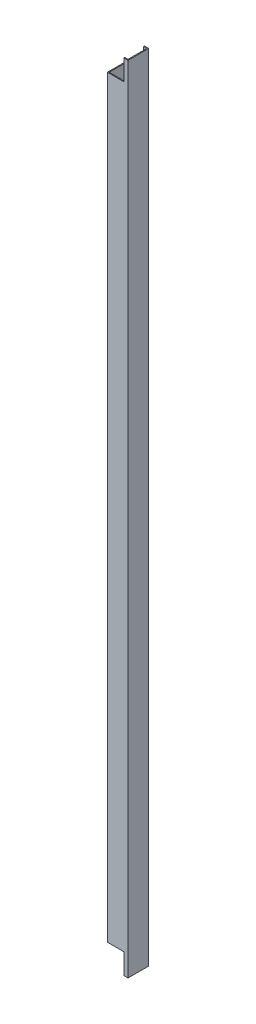
ISO-10303-21;
HEADER;
FILE_DESCRIPTION(('STEP AP214'),'2;1');
FILE_NAME('part.step','',(''),(''),'','','');
FILE_SCHEMA(('AUTOMOTIVE_DESIGN { 1 0 10303 214 1 1 1 1 }'));
ENDSEC;
DATA;
#1=APPLICATION_CONTEXT('core data for automotive mechanical design processes');
#2=APPLICATION_PROTOCOL_DEFINITION('international standard','automotive_design',2000,#1);
#3=PRODUCT_CONTEXT('',#1,'mechanical');
#4=PRODUCT('Part','Part','',(#3));
#5=PRODUCT_RELATED_PRODUCT_CATEGORY('part','',(#4));
#6=PRODUCT_DEFINITION_FORMATION('','',#4);
#7=PRODUCT_DEFINITION_CONTEXT('part definition',#1,'design');
#8=PRODUCT_DEFINITION('design','',#6,#7);
#9=PRODUCT_DEFINITION_SHAPE('','',#8);
#10=(LENGTH_UNIT() NAMED_UNIT(*) SI_UNIT(.MILLI.,.METRE.));
#11=(NAMED_UNIT(*) PLANE_ANGLE_UNIT() SI_UNIT($,.RADIAN.));
#12=(NAMED_UNIT(*) SI_UNIT($,.STERADIAN.) SOLID_ANGLE_UNIT());
#13=UNCERTAINTY_MEASURE_WITH_UNIT(LENGTH_MEASURE(1.E-05),#10,'distance_accuracy_value','');
#14=(GEOMETRIC_REPRESENTATION_CONTEXT(3) GLOBAL_UNCERTAINTY_ASSIGNED_CONTEXT((#13)) GLOBAL_UNIT_ASSIGNED_CONTEXT((#10,
#11,#12)) REPRESENTATION_CONTEXT('',''));
#15=CARTESIAN_POINT('',(0.,0.,0.));
#16=DIRECTION('',(0.,0.,1.));
#17=DIRECTION('',(1.,0.,0.));
#18=AXIS2_PLACEMENT_3D('',#15,#16,#17);
#19=CARTESIAN_POINT('',(0.,1923.,0.));
#20=DIRECTION('',(0.,-1.,0.));
#21=DIRECTION('',(0.,0.,-1.));
#22=AXIS2_PLACEMENT_3D('',#19,#20,#21);
#23=PLANE('',#22);
#24=DIRECTION('',(-1.,0.,0.));
#25=VECTOR('',#24,1.);
#26=CARTESIAN_POINT('',(0.,1923.,-50.));
#27=LINE('',#26,#25);
#28=CARTESIAN_POINT('',(50.,1923.,-50.));
#29=VERTEX_POINT('',#28);
#30=CARTESIAN_POINT('',(40.,1923.,-50.));
#31=VERTEX_POINT('',#30);
#32=EDGE_CURVE('E184',#29,#31,#27,.T.);
#33=ORIENTED_EDGE('',*,*,#32,.T.);
#34=DIRECTION('',(0.,0.,1.));
#35=VECTOR('',#34,1.);
#36=CARTESIAN_POINT('',(40.,1923.,-50.));
#37=LINE('',#36,#35);
#38=CARTESIAN_POINT('',(40.,1923.,-47.8));
#39=VERTEX_POINT('',#38);
#40=EDGE_CURVE('E257',#31,#39,#37,.T.);
#41=ORIENTED_EDGE('',*,*,#40,.T.);
#42=DIRECTION('',(-1.,0.,0.));
#43=VECTOR('',#42,1.);
#44=CARTESIAN_POINT('',(2.2,1923.,-47.8));
#45=LINE('',#44,#43);
#46=CARTESIAN_POINT('',(47.8,1923.,-47.8));
#47=VERTEX_POINT('',#46);
#48=EDGE_CURVE('E208',#47,#39,#45,.T.);
#49=ORIENTED_EDGE('',*,*,#48,.F.);
#50=DIRECTION('',(0.,0.,-1.));
#51=VECTOR('',#50,1.);
#52=CARTESIAN_POINT('',(47.8,1923.,-47.8));
#53=LINE('',#52,#51);
#54=CARTESIAN_POINT('',(47.8,1923.,-2.2));
#55=VERTEX_POINT('',#54);
#56=EDGE_CURVE('E213',#55,#47,#53,.T.);
#57=ORIENTED_EDGE('',*,*,#56,.F.);
#58=DIRECTION('',(1.,0.,0.));
#59=VECTOR('',#58,1.);
#60=CARTESIAN_POINT('',(47.8,1923.,-2.2));
#61=LINE('',#60,#59);
#62=CARTESIAN_POINT('',(40.,1923.,-2.2));
#63=VERTEX_POINT('',#62);
#64=EDGE_CURVE('E277',#63,#55,#61,.T.);
#65=ORIENTED_EDGE('',*,*,#64,.F.);
#66=CARTESIAN_POINT('',(40.,1923.,0.));
#67=VERTEX_POINT('',#66);
#68=EDGE_CURVE('E241',#63,#67,#37,.T.);
#69=ORIENTED_EDGE('',*,*,#68,.T.);
#70=DIRECTION('',(1.,0.,0.));
#71=VECTOR('',#70,1.);
#72=CARTESIAN_POINT('',(50.,1923.,0.));
#73=LINE('',#72,#71);
#74=CARTESIAN_POINT('',(50.,1923.,0.));
#75=VERTEX_POINT('',#74);
#76=EDGE_CURVE('E171',#67,#75,#73,.T.);
#77=ORIENTED_EDGE('',*,*,#76,.T.);
#78=DIRECTION('',(0.,0.,-1.));
#79=VECTOR('',#78,1.);
#80=CARTESIAN_POINT('',(50.,1923.,-50.));
#81=LINE('',#80,#79);
#82=EDGE_CURVE('E174',#75,#29,#81,.T.);
#83=ORIENTED_EDGE('',*,*,#82,.T.);
#84=EDGE_LOOP('',(#33,#41,#49,#57,#65,#69,#77,#83));
#85=FACE_BOUND('',#84,.T.);
#86=ADVANCED_FACE('F33',(#85),#23,.F.);
#87=CARTESIAN_POINT('',(0.,0.,0.));
#88=DIRECTION('',(0.,-1.,0.));
#89=DIRECTION('',(0.,0.,-1.));
#90=AXIS2_PLACEMENT_3D('',#87,#88,#89);
#91=PLANE('',#90);
#92=DIRECTION('',(0.,0.,1.));
#93=VECTOR('',#92,1.);
#94=CARTESIAN_POINT('',(40.,0.,-50.));
#95=LINE('',#94,#93);
#96=CARTESIAN_POINT('',(40.,0.,-50.));
#97=VERTEX_POINT('',#96);
#98=CARTESIAN_POINT('',(40.,0.,-47.8));
#99=VERTEX_POINT('',#98);
#100=EDGE_CURVE('E56',#97,#99,#95,.T.);
#101=ORIENTED_EDGE('',*,*,#100,.F.);
#102=DIRECTION('',(-1.,0.,0.));
#103=VECTOR('',#102,1.);
#104=CARTESIAN_POINT('',(0.,0.,-50.));
#105=LINE('',#104,#103);
#106=CARTESIAN_POINT('',(50.,0.,-50.));
#107=VERTEX_POINT('',#106);
#108=EDGE_CURVE('E159',#107,#97,#105,.T.);
#109=ORIENTED_EDGE('',*,*,#108,.F.);
#110=DIRECTION('',(0.,0.,-1.));
#111=VECTOR('',#110,1.);
#112=CARTESIAN_POINT('',(50.,0.,-50.));
#113=LINE('',#112,#111);
#114=CARTESIAN_POINT('',(50.,0.,0.));
#115=VERTEX_POINT('',#114);
#116=EDGE_CURVE('E172',#115,#107,#113,.T.);
#117=ORIENTED_EDGE('',*,*,#116,.F.);
#118=DIRECTION('',(1.,0.,0.));
#119=VECTOR('',#118,1.);
#120=CARTESIAN_POINT('',(50.,0.,0.));
#121=LINE('',#120,#119);
#122=CARTESIAN_POINT('',(40.,0.,0.));
#123=VERTEX_POINT('',#122);
#124=EDGE_CURVE('E176',#123,#115,#121,.T.);
#125=ORIENTED_EDGE('',*,*,#124,.F.);
#126=CARTESIAN_POINT('',(40.,0.,-2.2));
#127=VERTEX_POINT('',#126);
#128=EDGE_CURVE('E164',#127,#123,#95,.T.);
#129=ORIENTED_EDGE('',*,*,#128,.F.);
#130=DIRECTION('',(1.,0.,0.));
#131=VECTOR('',#130,1.);
#132=CARTESIAN_POINT('',(47.8,0.,-2.2));
#133=LINE('',#132,#131);
#134=CARTESIAN_POINT('',(47.8,0.,-2.2));
#135=VERTEX_POINT('',#134);
#136=EDGE_CURVE('E276',#127,#135,#133,.T.);
#137=ORIENTED_EDGE('',*,*,#136,.T.);
#138=DIRECTION('',(0.,0.,-1.));
#139=VECTOR('',#138,1.);
#140=CARTESIAN_POINT('',(47.8,0.,-47.8));
#141=LINE('',#140,#139);
#142=CARTESIAN_POINT('',(47.8,0.,-47.8));
#143=VERTEX_POINT('',#142);
#144=EDGE_CURVE('E281',#135,#143,#141,.T.);
#145=ORIENTED_EDGE('',*,*,#144,.T.);
#146=DIRECTION('',(-1.,0.,0.));
#147=VECTOR('',#146,1.);
#148=CARTESIAN_POINT('',(2.2,0.,-47.8));
#149=LINE('',#148,#147);
#150=EDGE_CURVE('E162',#143,#99,#149,.T.);
#151=ORIENTED_EDGE('',*,*,#150,.T.);
#152=EDGE_LOOP('',(#101,#109,#117,#125,#129,#137,#145,#151));
#153=FACE_BOUND('',#152,.T.);
#154=ADVANCED_FACE('F157',(#153),#91,.T.);
#155=CARTESIAN_POINT('',(50.,1923.,0.));
#156=DIRECTION('',(0.,0.,-1.));
#157=DIRECTION('',(-1.,0.,0.));
#158=AXIS2_PLACEMENT_3D('',#155,#156,#157);
#159=PLANE('',#158);
#160=DIRECTION('',(0.,-1.,0.));
#161=VECTOR('',#160,1.);
#162=CARTESIAN_POINT('',(0.,1923.,0.));
#163=LINE('',#162,#161);
#164=CARTESIAN_POINT('',(0.,1873.,0.));
#165=VERTEX_POINT('',#164);
#166=CARTESIAN_POINT('',(0.,50.,0.));
#167=VERTEX_POINT('',#166);
#168=EDGE_CURVE('E180',#165,#167,#163,.T.);
#169=ORIENTED_EDGE('',*,*,#168,.T.);
#170=DIRECTION('',(-1.,0.,0.));
#171=VECTOR('',#170,1.);
#172=CARTESIAN_POINT('',(0.,50.,0.));
#173=LINE('',#172,#171);
#174=CARTESIAN_POINT('',(40.,50.,0.));
#175=VERTEX_POINT('',#174);
#176=EDGE_CURVE('E152',#175,#167,#173,.T.);
#177=ORIENTED_EDGE('',*,*,#176,.F.);
#178=DIRECTION('',(0.,1.,0.));
#179=VECTOR('',#178,1.);
#180=CARTESIAN_POINT('',(40.,50.,0.));
#181=LINE('',#180,#179);
#182=EDGE_CURVE('E232',#123,#175,#181,.T.);
#183=ORIENTED_EDGE('',*,*,#182,.F.);
#184=ORIENTED_EDGE('',*,*,#124,.T.);
#185=DIRECTION('',(0.,-1.,0.));
#186=VECTOR('',#185,1.);
#187=CARTESIAN_POINT('',(50.,1923.,0.));
#188=LINE('',#187,#186);
#189=EDGE_CURVE('E188',#75,#115,#188,.T.);
#190=ORIENTED_EDGE('',*,*,#189,.F.);
#191=ORIENTED_EDGE('',*,*,#76,.F.);
#192=DIRECTION('',(0.,1.,0.));
#193=VECTOR('',#192,1.);
#194=CARTESIAN_POINT('',(40.,1923.,0.));
#195=LINE('',#194,#193);
#196=CARTESIAN_POINT('',(40.,1873.,0.));
#197=VERTEX_POINT('',#196);
#198=EDGE_CURVE('E244',#197,#67,#195,.T.);
#199=ORIENTED_EDGE('',*,*,#198,.F.);
#200=DIRECTION('',(1.,0.,0.));
#201=VECTOR('',#200,1.);
#202=CARTESIAN_POINT('',(40.,1873.,0.));
#203=LINE('',#202,#201);
#204=EDGE_CURVE('E246',#165,#197,#203,.T.);
#205=ORIENTED_EDGE('',*,*,#204,.F.);
#206=EDGE_LOOP('',(#169,#177,#183,#184,#190,#191,#199,#205));
#207=FACE_BOUND('',#206,.T.);
#208=ADVANCED_FACE('F35',(#207),#159,.F.);
#209=CARTESIAN_POINT('',(50.,1923.,-50.));
#210=DIRECTION('',(-1.,0.,0.));
#211=DIRECTION('',(0.,0.,1.));
#212=AXIS2_PLACEMENT_3D('',#209,#210,#211);
#213=PLANE('',#212);
#214=ORIENTED_EDGE('',*,*,#116,.T.);
#215=DIRECTION('',(0.,-1.,0.));
#216=VECTOR('',#215,1.);
#217=CARTESIAN_POINT('',(50.,1923.,-50.));
#218=LINE('',#217,#216);
#219=EDGE_CURVE('E170',#29,#107,#218,.T.);
#220=ORIENTED_EDGE('',*,*,#219,.F.);
#221=ORIENTED_EDGE('',*,*,#82,.F.);
#222=ORIENTED_EDGE('',*,*,#189,.T.);
#223=EDGE_LOOP('',(#214,#220,#221,#222));
#224=FACE_BOUND('',#223,.T.);
#225=ADVANCED_FACE('F236',(#224),#213,.F.);
#226=CARTESIAN_POINT('',(0.,1923.,-50.));
#227=DIRECTION('',(0.,0.,1.));
#228=DIRECTION('',(1.,0.,0.));
#229=AXIS2_PLACEMENT_3D('',#226,#227,#228);
#230=PLANE('',#229);
#231=DIRECTION('',(0.,1.,0.));
#232=VECTOR('',#231,1.);
#233=CARTESIAN_POINT('',(40.,50.,-50.));
#234=LINE('',#233,#232);
#235=CARTESIAN_POINT('',(40.,50.,-50.));
#236=VERTEX_POINT('',#235);
#237=EDGE_CURVE('E143',#97,#236,#234,.T.);
#238=ORIENTED_EDGE('',*,*,#237,.T.);
#239=DIRECTION('',(-1.,0.,0.));
#240=VECTOR('',#239,1.);
#241=CARTESIAN_POINT('',(0.,50.,-50.));
#242=LINE('',#241,#240);
#243=CARTESIAN_POINT('',(0.,50.,-50.));
#244=VERTEX_POINT('',#243);
#245=EDGE_CURVE('E151',#236,#244,#242,.T.);
#246=ORIENTED_EDGE('',*,*,#245,.T.);
#247=DIRECTION('',(0.,-1.,0.));
#248=VECTOR('',#247,1.);
#249=CARTESIAN_POINT('',(0.,1923.,-50.));
#250=LINE('',#249,#248);
#251=CARTESIAN_POINT('',(0.,1873.,-50.));
#252=VERTEX_POINT('',#251);
#253=EDGE_CURVE('E183',#252,#244,#250,.T.);
#254=ORIENTED_EDGE('',*,*,#253,.F.);
#255=DIRECTION('',(1.,0.,0.));
#256=VECTOR('',#255,1.);
#257=CARTESIAN_POINT('',(40.,1873.,-50.));
#258=LINE('',#257,#256);
#259=CARTESIAN_POINT('',(40.,1873.,-50.));
#260=VERTEX_POINT('',#259);
#261=EDGE_CURVE('E249',#252,#260,#258,.T.);
#262=ORIENTED_EDGE('',*,*,#261,.T.);
#263=DIRECTION('',(0.,1.,0.));
#264=VECTOR('',#263,1.);
#265=CARTESIAN_POINT('',(40.,1923.,-50.));
#266=LINE('',#265,#264);
#267=EDGE_CURVE('E252',#260,#31,#266,.T.);
#268=ORIENTED_EDGE('',*,*,#267,.T.);
#269=ORIENTED_EDGE('',*,*,#32,.F.);
#270=ORIENTED_EDGE('',*,*,#219,.T.);
#271=ORIENTED_EDGE('',*,*,#108,.T.);
#272=EDGE_LOOP('',(#238,#246,#254,#262,#268,#269,#270,#271));
#273=FACE_BOUND('',#272,.T.);
#274=ADVANCED_FACE('F167',(#273),#230,.F.);
#275=CARTESIAN_POINT('',(0.,1923.,0.));
#276=DIRECTION('',(1.,0.,0.));
#277=DIRECTION('',(0.,0.,-1.));
#278=AXIS2_PLACEMENT_3D('',#275,#276,#277);
#279=PLANE('',#278);
#280=ORIENTED_EDGE('',*,*,#253,.T.);
#281=DIRECTION('',(0.,0.,1.));
#282=VECTOR('',#281,1.);
#283=CARTESIAN_POINT('',(0.,50.,-50.));
#284=LINE('',#283,#282);
#285=EDGE_CURVE('E199',#244,#167,#284,.T.);
#286=ORIENTED_EDGE('',*,*,#285,.T.);
#287=ORIENTED_EDGE('',*,*,#168,.F.);
#288=DIRECTION('',(0.,0.,1.));
#289=VECTOR('',#288,1.);
#290=CARTESIAN_POINT('',(0.,1873.,-50.));
#291=LINE('',#290,#289);
#292=EDGE_CURVE('E263',#252,#165,#291,.T.);
#293=ORIENTED_EDGE('',*,*,#292,.F.);
#294=EDGE_LOOP('',(#280,#286,#287,#293));
#295=FACE_BOUND('',#294,.T.);
#296=ADVANCED_FACE('F314',(#295),#279,.F.);
#297=CARTESIAN_POINT('',(2.2,1923.,-2.2));
#298=DIRECTION('',(1.,0.,0.));
#299=DIRECTION('',(0.,0.,-1.));
#300=AXIS2_PLACEMENT_3D('',#297,#298,#299);
#301=PLANE('',#300);
#302=DIRECTION('',(0.,0.,1.));
#303=VECTOR('',#302,1.);
#304=CARTESIAN_POINT('',(2.2,50.,-2.2));
#305=LINE('',#304,#303);
#306=CARTESIAN_POINT('',(2.2,50.,-47.8));
#307=VERTEX_POINT('',#306);
#308=CARTESIAN_POINT('',(2.2,50.,-2.2));
#309=VERTEX_POINT('',#308);
#310=EDGE_CURVE('E272',#307,#309,#305,.T.);
#311=ORIENTED_EDGE('',*,*,#310,.F.);
#312=DIRECTION('',(0.,-1.,0.));
#313=VECTOR('',#312,1.);
#314=CARTESIAN_POINT('',(2.2,1923.,-47.8));
#315=LINE('',#314,#313);
#316=CARTESIAN_POINT('',(2.2,1873.,-47.8));
#317=VERTEX_POINT('',#316);
#318=EDGE_CURVE('E204',#317,#307,#315,.T.);
#319=ORIENTED_EDGE('',*,*,#318,.F.);
#320=DIRECTION('',(0.,0.,-1.));
#321=VECTOR('',#320,1.);
#322=CARTESIAN_POINT('',(2.2,1873.,-2.2));
#323=LINE('',#322,#321);
#324=CARTESIAN_POINT('',(2.2,1873.,-2.2));
#325=VERTEX_POINT('',#324);
#326=EDGE_CURVE('E48',#325,#317,#323,.T.);
#327=ORIENTED_EDGE('',*,*,#326,.F.);
#328=DIRECTION('',(0.,-1.,0.));
#329=VECTOR('',#328,1.);
#330=CARTESIAN_POINT('',(2.2,1923.,-2.2));
#331=LINE('',#330,#329);
#332=EDGE_CURVE('E220',#325,#309,#331,.T.);
#333=ORIENTED_EDGE('',*,*,#332,.T.);
#334=EDGE_LOOP('',(#311,#319,#327,#333));
#335=FACE_BOUND('',#334,.T.);
#336=ADVANCED_FACE('F315',(#335),#301,.T.);
#337=CARTESIAN_POINT('',(47.8,1923.,-2.2));
#338=DIRECTION('',(0.,0.,-1.));
#339=DIRECTION('',(-1.,0.,0.));
#340=AXIS2_PLACEMENT_3D('',#337,#338,#339);
#341=PLANE('',#340);
#342=DIRECTION('',(1.,0.,0.));
#343=VECTOR('',#342,1.);
#344=CARTESIAN_POINT('',(47.8,50.,-2.2));
#345=LINE('',#344,#343);
#346=CARTESIAN_POINT('',(40.,50.,-2.2));
#347=VERTEX_POINT('',#346);
#348=EDGE_CURVE('E274',#309,#347,#345,.T.);
#349=ORIENTED_EDGE('',*,*,#348,.F.);
#350=ORIENTED_EDGE('',*,*,#332,.F.);
#351=DIRECTION('',(-1.,0.,0.));
#352=VECTOR('',#351,1.);
#353=CARTESIAN_POINT('',(47.8,1873.,-2.2));
#354=LINE('',#353,#352);
#355=CARTESIAN_POINT('',(40.,1873.,-2.2));
#356=VERTEX_POINT('',#355);
#357=EDGE_CURVE('E266',#356,#325,#354,.T.);
#358=ORIENTED_EDGE('',*,*,#357,.F.);
#359=DIRECTION('',(0.,-1.,0.));
#360=VECTOR('',#359,1.);
#361=CARTESIAN_POINT('',(40.,1923.,-2.2));
#362=LINE('',#361,#360);
#363=EDGE_CURVE('E268',#63,#356,#362,.T.);
#364=ORIENTED_EDGE('',*,*,#363,.F.);
#365=ORIENTED_EDGE('',*,*,#64,.T.);
#366=DIRECTION('',(0.,-1.,0.));
#367=VECTOR('',#366,1.);
#368=CARTESIAN_POINT('',(47.8,1923.,-2.2));
#369=LINE('',#368,#367);
#370=EDGE_CURVE('E210',#55,#135,#369,.T.);
#371=ORIENTED_EDGE('',*,*,#370,.T.);
#372=ORIENTED_EDGE('',*,*,#136,.F.);
#373=DIRECTION('',(0.,-1.,0.));
#374=VECTOR('',#373,1.);
#375=CARTESIAN_POINT('',(39.9999999999995,1923.,-2.2));
#376=LINE('',#375,#374);
#377=EDGE_CURVE('E270',#347,#127,#376,.T.);
#378=ORIENTED_EDGE('',*,*,#377,.F.);
#379=EDGE_LOOP('',(#349,#350,#358,#364,#365,#371,#372,#378));
#380=FACE_BOUND('',#379,.T.);
#381=ADVANCED_FACE('F305',(#380),#341,.T.);
#382=CARTESIAN_POINT('',(47.8,1923.,-47.8));
#383=DIRECTION('',(-1.,0.,0.));
#384=DIRECTION('',(0.,0.,1.));
#385=AXIS2_PLACEMENT_3D('',#382,#383,#384);
#386=PLANE('',#385);
#387=ORIENTED_EDGE('',*,*,#144,.F.);
#388=ORIENTED_EDGE('',*,*,#370,.F.);
#389=ORIENTED_EDGE('',*,*,#56,.T.);
#390=DIRECTION('',(0.,-1.,0.));
#391=VECTOR('',#390,1.);
#392=CARTESIAN_POINT('',(47.8,1923.,-47.8));
#393=LINE('',#392,#391);
#394=EDGE_CURVE('E207',#47,#143,#393,.T.);
#395=ORIENTED_EDGE('',*,*,#394,.T.);
#396=EDGE_LOOP('',(#387,#388,#389,#395));
#397=FACE_BOUND('',#396,.T.);
#398=ADVANCED_FACE('F286',(#397),#386,.T.);
#399=CARTESIAN_POINT('',(2.2,1923.,-47.8));
#400=DIRECTION('',(0.,0.,1.));
#401=DIRECTION('',(1.,0.,0.));
#402=AXIS2_PLACEMENT_3D('',#399,#400,#401);
#403=PLANE('',#402);
#404=DIRECTION('',(-1.,0.,0.));
#405=VECTOR('',#404,1.);
#406=CARTESIAN_POINT('',(2.2,50.,-47.8));
#407=LINE('',#406,#405);
#408=CARTESIAN_POINT('',(40.,50.,-47.8));
#409=VERTEX_POINT('',#408);
#410=EDGE_CURVE('E11',#409,#307,#407,.T.);
#411=ORIENTED_EDGE('',*,*,#410,.F.);
#412=DIRECTION('',(0.,1.,0.));
#413=VECTOR('',#412,1.);
#414=CARTESIAN_POINT('',(39.9999999999995,1923.,-47.8));
#415=LINE('',#414,#413);
#416=EDGE_CURVE('E41',#99,#409,#415,.T.);
#417=ORIENTED_EDGE('',*,*,#416,.F.);
#418=ORIENTED_EDGE('',*,*,#150,.F.);
#419=ORIENTED_EDGE('',*,*,#394,.F.);
#420=ORIENTED_EDGE('',*,*,#48,.T.);
#421=DIRECTION('',(0.,1.,0.));
#422=VECTOR('',#421,1.);
#423=CARTESIAN_POINT('',(40.,1923.,-47.8));
#424=LINE('',#423,#422);
#425=CARTESIAN_POINT('',(40.,1873.,-47.8));
#426=VERTEX_POINT('',#425);
#427=EDGE_CURVE('E193',#426,#39,#424,.T.);
#428=ORIENTED_EDGE('',*,*,#427,.F.);
#429=DIRECTION('',(1.,0.,0.));
#430=VECTOR('',#429,1.);
#431=CARTESIAN_POINT('',(2.2,1873.,-47.8));
#432=LINE('',#431,#430);
#433=EDGE_CURVE('E191',#317,#426,#432,.T.);
#434=ORIENTED_EDGE('',*,*,#433,.F.);
#435=ORIENTED_EDGE('',*,*,#318,.T.);
#436=EDGE_LOOP('',(#411,#417,#418,#419,#420,#428,#434,#435));
#437=FACE_BOUND('',#436,.T.);
#438=ADVANCED_FACE('F202',(#437),#403,.T.);
#439=CARTESIAN_POINT('',(40.,1923.,-50.));
#440=DIRECTION('',(1.,0.,0.));
#441=DIRECTION('',(0.,1.,0.));
#442=AXIS2_PLACEMENT_3D('',#439,#440,#441);
#443=PLANE('',#442);
#444=ORIENTED_EDGE('',*,*,#363,.T.);
#445=DIRECTION('',(0.,0.,1.));
#446=VECTOR('',#445,1.);
#447=CARTESIAN_POINT('',(40.,1873.,-50.));
#448=LINE('',#447,#446);
#449=EDGE_CURVE('E262',#356,#197,#448,.T.);
#450=ORIENTED_EDGE('',*,*,#449,.T.);
#451=ORIENTED_EDGE('',*,*,#198,.T.);
#452=ORIENTED_EDGE('',*,*,#68,.F.);
#453=EDGE_LOOP('',(#444,#450,#451,#452));
#454=FACE_BOUND('',#453,.T.);
#455=ADVANCED_FACE('F310',(#454),#443,.F.);
#456=ORIENTED_EDGE('',*,*,#427,.T.);
#457=ORIENTED_EDGE('',*,*,#40,.F.);
#458=ORIENTED_EDGE('',*,*,#267,.F.);
#459=EDGE_CURVE('E259',#260,#426,#448,.T.);
#460=ORIENTED_EDGE('',*,*,#459,.T.);
#461=EDGE_LOOP('',(#456,#457,#458,#460));
#462=FACE_BOUND('',#461,.T.);
#463=ADVANCED_FACE('F292',(#462),#443,.F.);
#464=CARTESIAN_POINT('',(40.,1873.,-50.));
#465=DIRECTION('',(0.,-1.,0.));
#466=DIRECTION('',(0.,0.,-1.));
#467=AXIS2_PLACEMENT_3D('',#464,#465,#466);
#468=PLANE('',#467);
#469=ORIENTED_EDGE('',*,*,#357,.T.);
#470=ORIENTED_EDGE('',*,*,#326,.T.);
#471=ORIENTED_EDGE('',*,*,#433,.T.);
#472=ORIENTED_EDGE('',*,*,#459,.F.);
#473=ORIENTED_EDGE('',*,*,#261,.F.);
#474=ORIENTED_EDGE('',*,*,#292,.T.);
#475=ORIENTED_EDGE('',*,*,#204,.T.);
#476=ORIENTED_EDGE('',*,*,#449,.F.);
#477=EDGE_LOOP('',(#469,#470,#471,#472,#473,#474,#475,#476));
#478=FACE_BOUND('',#477,.T.);
#479=ADVANCED_FACE('F311',(#478),#468,.F.);
#480=CARTESIAN_POINT('',(40.,50.,-50.));
#481=DIRECTION('',(1.,0.,0.));
#482=DIRECTION('',(0.,1.,0.));
#483=AXIS2_PLACEMENT_3D('',#480,#481,#482);
#484=PLANE('',#483);
#485=ORIENTED_EDGE('',*,*,#377,.T.);
#486=ORIENTED_EDGE('',*,*,#128,.T.);
#487=ORIENTED_EDGE('',*,*,#182,.T.);
#488=DIRECTION('',(0.,0.,1.));
#489=VECTOR('',#488,1.);
#490=CARTESIAN_POINT('',(40.,50.,-50.));
#491=LINE('',#490,#489);
#492=EDGE_CURVE('E163',#347,#175,#491,.T.);
#493=ORIENTED_EDGE('',*,*,#492,.F.);
#494=EDGE_LOOP('',(#485,#486,#487,#493));
#495=FACE_BOUND('',#494,.T.);
#496=ADVANCED_FACE('F300',(#495),#484,.F.);
#497=CARTESIAN_POINT('',(0.,50.,-50.));
#498=DIRECTION('',(0.,1.,0.));
#499=DIRECTION('',(0.,0.,1.));
#500=AXIS2_PLACEMENT_3D('',#497,#498,#499);
#501=PLANE('',#500);
#502=ORIENTED_EDGE('',*,*,#348,.T.);
#503=ORIENTED_EDGE('',*,*,#492,.T.);
#504=ORIENTED_EDGE('',*,*,#176,.T.);
#505=ORIENTED_EDGE('',*,*,#285,.F.);
#506=ORIENTED_EDGE('',*,*,#245,.F.);
#507=EDGE_CURVE('E146',#236,#409,#491,.T.);
#508=ORIENTED_EDGE('',*,*,#507,.T.);
#509=ORIENTED_EDGE('',*,*,#410,.T.);
#510=ORIENTED_EDGE('',*,*,#310,.T.);
#511=EDGE_LOOP('',(#502,#503,#504,#505,#506,#508,#509,#510));
#512=FACE_BOUND('',#511,.T.);
#513=ADVANCED_FACE('F197',(#512),#501,.F.);
#514=ORIENTED_EDGE('',*,*,#416,.T.);
#515=ORIENTED_EDGE('',*,*,#507,.F.);
#516=ORIENTED_EDGE('',*,*,#237,.F.);
#517=ORIENTED_EDGE('',*,*,#100,.T.);
#518=EDGE_LOOP('',(#514,#515,#516,#517));
#519=FACE_BOUND('',#518,.T.);
#520=ADVANCED_FACE('F144',(#519),#484,.F.);
#521=CLOSED_SHELL('',(#86,#154,#208,#225,#274,#296,#336,#381,#398,#438,#455,#463,#479,#496,#513,#520));
#522=MANIFOLD_SOLID_BREP('B2',#521);
#523=ADVANCED_BREP_SHAPE_REPRESENTATION('',(#18,#522),#14);
#524=SHAPE_DEFINITION_REPRESENTATION(#9,#523);
ENDSEC;
END-ISO-10303-21;
